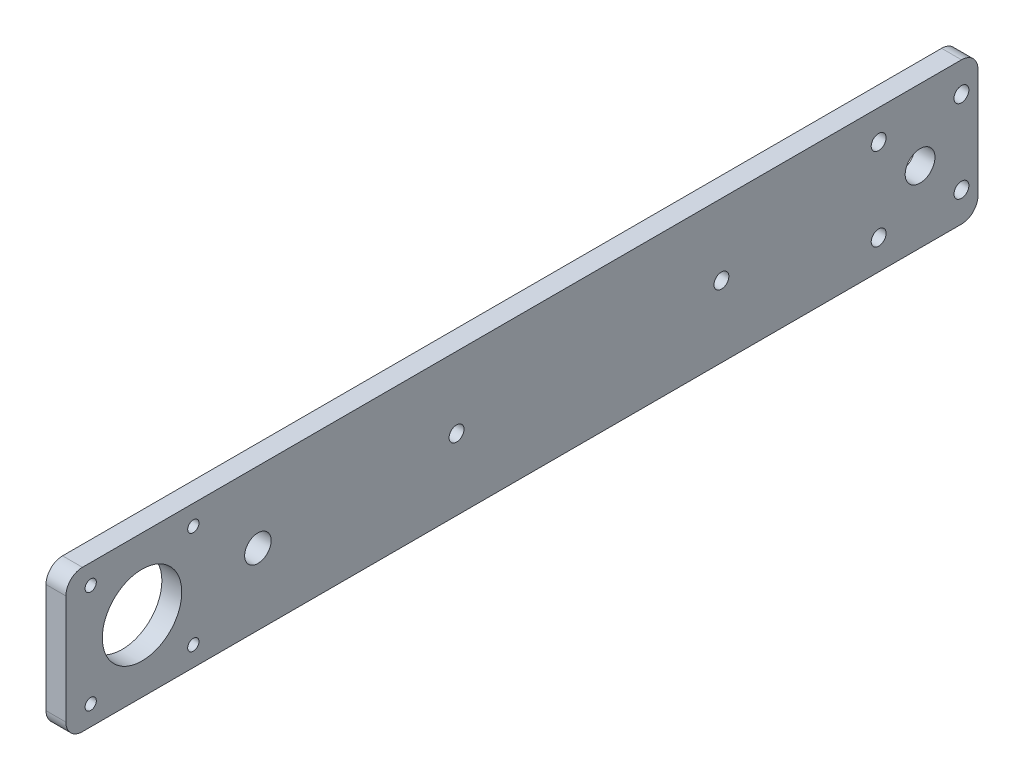
ISO-10303-21;
HEADER;
FILE_DESCRIPTION(('STEP AP214'),'2;1');
FILE_NAME('part.step','',(''),(''),'','','');
FILE_SCHEMA(('AUTOMOTIVE_DESIGN { 1 0 10303 214 1 1 1 1 }'));
ENDSEC;
DATA;
#1=APPLICATION_CONTEXT('core data for automotive mechanical design processes');
#2=APPLICATION_PROTOCOL_DEFINITION('international standard','automotive_design',2000,#1);
#3=PRODUCT_CONTEXT('',#1,'mechanical');
#4=PRODUCT('Part','Part','',(#3));
#5=PRODUCT_RELATED_PRODUCT_CATEGORY('part','',(#4));
#6=PRODUCT_DEFINITION_FORMATION('','',#4);
#7=PRODUCT_DEFINITION_CONTEXT('part definition',#1,'design');
#8=PRODUCT_DEFINITION('design','',#6,#7);
#9=PRODUCT_DEFINITION_SHAPE('','',#8);
#10=(LENGTH_UNIT() NAMED_UNIT(*) SI_UNIT(.MILLI.,.METRE.));
#11=(NAMED_UNIT(*) PLANE_ANGLE_UNIT() SI_UNIT($,.RADIAN.));
#12=(NAMED_UNIT(*) SI_UNIT($,.STERADIAN.) SOLID_ANGLE_UNIT());
#13=UNCERTAINTY_MEASURE_WITH_UNIT(LENGTH_MEASURE(1.E-05),#10,'distance_accuracy_value','');
#14=(GEOMETRIC_REPRESENTATION_CONTEXT(3) GLOBAL_UNCERTAINTY_ASSIGNED_CONTEXT((#13)) GLOBAL_UNIT_ASSIGNED_CONTEXT((#10,
#11,#12)) REPRESENTATION_CONTEXT('',''));
#15=CARTESIAN_POINT('',(0.,0.,0.));
#16=DIRECTION('',(0.,0.,1.));
#17=DIRECTION('',(1.,0.,0.));
#18=AXIS2_PLACEMENT_3D('',#15,#16,#17);
#19=CARTESIAN_POINT('',(3.,0.,0.));
#20=DIRECTION('',(-1.,0.,0.));
#21=DIRECTION('',(0.,0.,1.));
#22=AXIS2_PLACEMENT_3D('',#19,#20,#21);
#23=PLANE('',#22);
#24=CARTESIAN_POINT('',(3.,0.,-40.));
#25=DIRECTION('',(-1.,0.,0.));
#26=DIRECTION('',(0.,0.,1.));
#27=AXIS2_PLACEMENT_3D('',#24,#25,#26);
#28=CIRCLE('',#27,2.24999999999999);
#29=CARTESIAN_POINT('',(3.,0.,-37.75));
#30=VERTEX_POINT('',#29);
#31=EDGE_CURVE('E245',#30,#30,#28,.T.);
#32=ORIENTED_EDGE('',*,*,#31,.T.);
#33=EDGE_LOOP('',(#32));
#34=FACE_BOUND('',#33,.T.);
#35=CARTESIAN_POINT('',(3.,0.,40.));
#36=DIRECTION('',(-1.,0.,0.));
#37=DIRECTION('',(0.,0.,1.));
#38=AXIS2_PLACEMENT_3D('',#35,#36,#37);
#39=CIRCLE('',#38,2.24999999999999);
#40=CARTESIAN_POINT('',(3.,0.,42.25));
#41=VERTEX_POINT('',#40);
#42=EDGE_CURVE('E239',#41,#41,#39,.T.);
#43=ORIENTED_EDGE('',*,*,#42,.T.);
#44=EDGE_LOOP('',(#43));
#45=FACE_BOUND('',#44,.T.);
#46=CARTESIAN_POINT('',(3.,15.5000000000001,150.499999999996));
#47=DIRECTION('',(-1.,0.,0.));
#48=DIRECTION('',(0.,0.,1.));
#49=AXIS2_PLACEMENT_3D('',#46,#47,#48);
#50=CIRCLE('',#49,1.7);
#51=CARTESIAN_POINT('',(3.,15.5000000000001,152.199999999996));
#52=VERTEX_POINT('',#51);
#53=EDGE_CURVE('E233',#52,#52,#50,.T.);
#54=ORIENTED_EDGE('',*,*,#53,.T.);
#55=EDGE_LOOP('',(#54));
#56=FACE_BOUND('',#55,.T.);
#57=CARTESIAN_POINT('',(3.,15.5000000000001,119.499999999996));
#58=DIRECTION('',(-1.,0.,0.));
#59=DIRECTION('',(0.,0.,1.));
#60=AXIS2_PLACEMENT_3D('',#57,#58,#59);
#61=CIRCLE('',#60,1.7);
#62=CARTESIAN_POINT('',(3.,15.5000000000001,121.199999999996));
#63=VERTEX_POINT('',#62);
#64=EDGE_CURVE('E227',#63,#63,#61,.T.);
#65=ORIENTED_EDGE('',*,*,#64,.T.);
#66=EDGE_LOOP('',(#65));
#67=FACE_BOUND('',#66,.T.);
#68=CARTESIAN_POINT('',(3.,-15.4999999999999,119.499999999996));
#69=DIRECTION('',(-1.,0.,0.));
#70=DIRECTION('',(0.,0.,1.));
#71=AXIS2_PLACEMENT_3D('',#68,#69,#70);
#72=CIRCLE('',#71,1.7);
#73=CARTESIAN_POINT('',(3.,-15.4999999999999,121.199999999996));
#74=VERTEX_POINT('',#73);
#75=EDGE_CURVE('E221',#74,#74,#72,.T.);
#76=ORIENTED_EDGE('',*,*,#75,.T.);
#77=EDGE_LOOP('',(#76));
#78=FACE_BOUND('',#77,.T.);
#79=CARTESIAN_POINT('',(3.,-15.4999999999999,150.499999999996));
#80=DIRECTION('',(-1.,0.,0.));
#81=DIRECTION('',(0.,0.,1.));
#82=AXIS2_PLACEMENT_3D('',#79,#80,#81);
#83=CIRCLE('',#82,1.7);
#84=CARTESIAN_POINT('',(3.,-15.4999999999999,152.199999999996));
#85=VERTEX_POINT('',#84);
#86=EDGE_CURVE('E215',#85,#85,#83,.T.);
#87=ORIENTED_EDGE('',*,*,#86,.T.);
#88=EDGE_LOOP('',(#87));
#89=FACE_BOUND('',#88,.T.);
#90=CARTESIAN_POINT('',(3.,12.4999999999841,-112.500000000009));
#91=DIRECTION('',(1.,0.,0.));
#92=DIRECTION('',(0.,0.,-1.));
#93=AXIS2_PLACEMENT_3D('',#90,#91,#92);
#94=CIRCLE('',#93,2.25);
#95=CARTESIAN_POINT('',(3.,12.4999999999841,-114.750000000009));
#96=VERTEX_POINT('',#95);
#97=EDGE_CURVE('E212',#96,#96,#94,.T.);
#98=ORIENTED_EDGE('',*,*,#97,.F.);
#99=EDGE_LOOP('',(#98));
#100=FACE_BOUND('',#99,.T.);
#101=CARTESIAN_POINT('',(3.,-12.5000000000159,-112.500000000009));
#102=DIRECTION('',(1.,0.,0.));
#103=DIRECTION('',(0.,0.,-1.));
#104=AXIS2_PLACEMENT_3D('',#101,#102,#103);
#105=CIRCLE('',#104,2.25);
#106=CARTESIAN_POINT('',(3.,-12.5000000000159,-114.750000000009));
#107=VERTEX_POINT('',#106);
#108=EDGE_CURVE('E206',#107,#107,#105,.T.);
#109=ORIENTED_EDGE('',*,*,#108,.F.);
#110=EDGE_LOOP('',(#109));
#111=FACE_BOUND('',#110,.T.);
#112=CARTESIAN_POINT('',(3.,-12.5000000000156,-87.5000000000087));
#113=DIRECTION('',(1.,0.,0.));
#114=DIRECTION('',(0.,0.,-1.));
#115=AXIS2_PLACEMENT_3D('',#112,#113,#114);
#116=CIRCLE('',#115,2.25);
#117=CARTESIAN_POINT('',(3.,-12.5000000000156,-89.7500000000087));
#118=VERTEX_POINT('',#117);
#119=EDGE_CURVE('E200',#118,#118,#116,.T.);
#120=ORIENTED_EDGE('',*,*,#119,.F.);
#121=EDGE_LOOP('',(#120));
#122=FACE_BOUND('',#121,.T.);
#123=DIRECTION('',(0.,0.,-1.));
#124=VECTOR('',#123,1.);
#125=CARTESIAN_POINT('',(3.,-21.5,-117.5));
#126=LINE('',#125,#124);
#127=CARTESIAN_POINT('',(3.,-21.5,153.));
#128=VERTEX_POINT('',#127);
#129=CARTESIAN_POINT('',(3.,-21.5,-112.5));
#130=VERTEX_POINT('',#129);
#131=EDGE_CURVE('E173',#128,#130,#126,.T.);
#132=ORIENTED_EDGE('',*,*,#131,.T.);
#133=CARTESIAN_POINT('',(3.,-16.5,-112.5));
#134=DIRECTION('',(-1.,0.,0.));
#135=DIRECTION('',(0.,0.,1.));
#136=AXIS2_PLACEMENT_3D('',#133,#134,#135);
#137=CIRCLE('',#136,5.);
#138=CARTESIAN_POINT('',(3.,-16.5,-117.5));
#139=VERTEX_POINT('',#138);
#140=EDGE_CURVE('E150',#130,#139,#137,.F.);
#141=ORIENTED_EDGE('',*,*,#140,.T.);
#142=DIRECTION('',(0.,1.,0.));
#143=VECTOR('',#142,1.);
#144=CARTESIAN_POINT('',(3.,21.5,-117.5));
#145=LINE('',#144,#143);
#146=CARTESIAN_POINT('',(3.,16.5,-117.5));
#147=VERTEX_POINT('',#146);
#148=EDGE_CURVE('E120',#139,#147,#145,.T.);
#149=ORIENTED_EDGE('',*,*,#148,.T.);
#150=CARTESIAN_POINT('',(3.,16.5,-112.5));
#151=DIRECTION('',(-1.,0.,0.));
#152=DIRECTION('',(0.,0.,1.));
#153=AXIS2_PLACEMENT_3D('',#150,#151,#152);
#154=CIRCLE('',#153,5.);
#155=CARTESIAN_POINT('',(3.,21.5,-112.5));
#156=VERTEX_POINT('',#155);
#157=EDGE_CURVE('E57',#147,#156,#154,.F.);
#158=ORIENTED_EDGE('',*,*,#157,.T.);
#159=DIRECTION('',(0.,0.,1.));
#160=VECTOR('',#159,1.);
#161=CARTESIAN_POINT('',(3.,21.5,158.));
#162=LINE('',#161,#160);
#163=CARTESIAN_POINT('',(3.,21.5,153.));
#164=VERTEX_POINT('',#163);
#165=EDGE_CURVE('E136',#156,#164,#162,.T.);
#166=ORIENTED_EDGE('',*,*,#165,.T.);
#167=CARTESIAN_POINT('',(3.,16.5,153.));
#168=DIRECTION('',(-1.,0.,0.));
#169=DIRECTION('',(0.,0.,1.));
#170=AXIS2_PLACEMENT_3D('',#167,#168,#169);
#171=CIRCLE('',#170,5.);
#172=CARTESIAN_POINT('',(3.,16.5,158.));
#173=VERTEX_POINT('',#172);
#174=EDGE_CURVE('E145',#164,#173,#171,.F.);
#175=ORIENTED_EDGE('',*,*,#174,.T.);
#176=DIRECTION('',(0.,-1.,0.));
#177=VECTOR('',#176,1.);
#178=CARTESIAN_POINT('',(3.,21.5,158.));
#179=LINE('',#178,#177);
#180=CARTESIAN_POINT('',(3.,-16.5,158.));
#181=VERTEX_POINT('',#180);
#182=EDGE_CURVE('E130',#173,#181,#179,.T.);
#183=ORIENTED_EDGE('',*,*,#182,.T.);
#184=CARTESIAN_POINT('',(3.,-16.5,153.));
#185=DIRECTION('',(-1.,0.,0.));
#186=DIRECTION('',(0.,0.,1.));
#187=AXIS2_PLACEMENT_3D('',#184,#185,#186);
#188=CIRCLE('',#187,5.);
#189=EDGE_CURVE('E147',#181,#128,#188,.F.);
#190=ORIENTED_EDGE('',*,*,#189,.T.);
#191=EDGE_LOOP('',(#132,#141,#149,#158,#166,#175,#183,#190));
#192=FACE_BOUND('',#191,.T.);
#193=CARTESIAN_POINT('',(3.,0.,100.));
#194=DIRECTION('',(1.,0.,0.));
#195=DIRECTION('',(0.,0.,-1.));
#196=AXIS2_PLACEMENT_3D('',#193,#194,#195);
#197=CIRCLE('',#196,3.99999999999999);
#198=CARTESIAN_POINT('',(3.,0.,96.));
#199=VERTEX_POINT('',#198);
#200=EDGE_CURVE('E166',#199,#199,#197,.T.);
#201=ORIENTED_EDGE('',*,*,#200,.F.);
#202=EDGE_LOOP('',(#201));
#203=FACE_BOUND('',#202,.T.);
#204=CARTESIAN_POINT('',(3.,0.,-100.));
#205=DIRECTION('',(1.,0.,0.));
#206=DIRECTION('',(0.,0.,-1.));
#207=AXIS2_PLACEMENT_3D('',#204,#205,#206);
#208=CIRCLE('',#207,4.5);
#209=CARTESIAN_POINT('',(3.,0.,-104.5));
#210=VERTEX_POINT('',#209);
#211=EDGE_CURVE('E178',#210,#210,#208,.T.);
#212=ORIENTED_EDGE('',*,*,#211,.F.);
#213=EDGE_LOOP('',(#212));
#214=FACE_BOUND('',#213,.T.);
#215=CARTESIAN_POINT('',(3.,0.,135.));
#216=DIRECTION('',(1.,0.,0.));
#217=DIRECTION('',(0.,0.,-1.));
#218=AXIS2_PLACEMENT_3D('',#215,#216,#217);
#219=CIRCLE('',#218,12.);
#220=CARTESIAN_POINT('',(3.,0.,123.));
#221=VERTEX_POINT('',#220);
#222=EDGE_CURVE('E183',#221,#221,#219,.T.);
#223=ORIENTED_EDGE('',*,*,#222,.F.);
#224=EDGE_LOOP('',(#223));
#225=FACE_BOUND('',#224,.T.);
#226=CARTESIAN_POINT('',(3.,12.4999999999844,-87.500000000009));
#227=DIRECTION('',(1.,0.,0.));
#228=DIRECTION('',(0.,0.,-1.));
#229=AXIS2_PLACEMENT_3D('',#226,#227,#228);
#230=CIRCLE('',#229,2.25);
#231=CARTESIAN_POINT('',(3.,12.4999999999844,-89.750000000009));
#232=VERTEX_POINT('',#231);
#233=EDGE_CURVE('E194',#232,#232,#230,.T.);
#234=ORIENTED_EDGE('',*,*,#233,.F.);
#235=EDGE_LOOP('',(#234));
#236=FACE_BOUND('',#235,.T.);
#237=ADVANCED_FACE('F35',(#34,#45,#56,#67,#78,#89,#100,#111,#122,#192,#203,#214,#225,#236),#23,.F.);
#238=CARTESIAN_POINT('',(-3.,0.,0.));
#239=DIRECTION('',(-1.,0.,0.));
#240=DIRECTION('',(0.,0.,1.));
#241=AXIS2_PLACEMENT_3D('',#238,#239,#240);
#242=PLANE('',#241);
#243=CARTESIAN_POINT('',(-3.,0.,-40.));
#244=DIRECTION('',(-1.,0.,0.));
#245=DIRECTION('',(0.,0.,1.));
#246=AXIS2_PLACEMENT_3D('',#243,#244,#245);
#247=CIRCLE('',#246,2.24999999999999);
#248=CARTESIAN_POINT('',(-3.,0.,-37.75));
#249=VERTEX_POINT('',#248);
#250=EDGE_CURVE('E248',#249,#249,#247,.T.);
#251=ORIENTED_EDGE('',*,*,#250,.F.);
#252=EDGE_LOOP('',(#251));
#253=FACE_BOUND('',#252,.T.);
#254=CARTESIAN_POINT('',(-3.,0.,40.));
#255=DIRECTION('',(-1.,0.,0.));
#256=DIRECTION('',(0.,0.,1.));
#257=AXIS2_PLACEMENT_3D('',#254,#255,#256);
#258=CIRCLE('',#257,2.24999999999999);
#259=CARTESIAN_POINT('',(-3.,0.,42.25));
#260=VERTEX_POINT('',#259);
#261=EDGE_CURVE('E242',#260,#260,#258,.T.);
#262=ORIENTED_EDGE('',*,*,#261,.F.);
#263=EDGE_LOOP('',(#262));
#264=FACE_BOUND('',#263,.T.);
#265=CARTESIAN_POINT('',(-3.,15.5000000000001,150.499999999996));
#266=DIRECTION('',(-1.,0.,0.));
#267=DIRECTION('',(0.,0.,1.));
#268=AXIS2_PLACEMENT_3D('',#265,#266,#267);
#269=CIRCLE('',#268,1.7);
#270=CARTESIAN_POINT('',(-3.,15.5000000000001,152.199999999996));
#271=VERTEX_POINT('',#270);
#272=EDGE_CURVE('E236',#271,#271,#269,.T.);
#273=ORIENTED_EDGE('',*,*,#272,.F.);
#274=EDGE_LOOP('',(#273));
#275=FACE_BOUND('',#274,.T.);
#276=CARTESIAN_POINT('',(-3.,15.5000000000001,119.499999999996));
#277=DIRECTION('',(-1.,0.,0.));
#278=DIRECTION('',(0.,0.,1.));
#279=AXIS2_PLACEMENT_3D('',#276,#277,#278);
#280=CIRCLE('',#279,1.7);
#281=CARTESIAN_POINT('',(-3.,15.5000000000001,121.199999999996));
#282=VERTEX_POINT('',#281);
#283=EDGE_CURVE('E230',#282,#282,#280,.T.);
#284=ORIENTED_EDGE('',*,*,#283,.F.);
#285=EDGE_LOOP('',(#284));
#286=FACE_BOUND('',#285,.T.);
#287=CARTESIAN_POINT('',(-3.,-15.4999999999999,119.499999999996));
#288=DIRECTION('',(-1.,0.,0.));
#289=DIRECTION('',(0.,0.,1.));
#290=AXIS2_PLACEMENT_3D('',#287,#288,#289);
#291=CIRCLE('',#290,1.7);
#292=CARTESIAN_POINT('',(-3.,-15.4999999999999,121.199999999996));
#293=VERTEX_POINT('',#292);
#294=EDGE_CURVE('E224',#293,#293,#291,.T.);
#295=ORIENTED_EDGE('',*,*,#294,.F.);
#296=EDGE_LOOP('',(#295));
#297=FACE_BOUND('',#296,.T.);
#298=CARTESIAN_POINT('',(-3.,-15.4999999999999,150.499999999996));
#299=DIRECTION('',(-1.,0.,0.));
#300=DIRECTION('',(0.,0.,1.));
#301=AXIS2_PLACEMENT_3D('',#298,#299,#300);
#302=CIRCLE('',#301,1.7);
#303=CARTESIAN_POINT('',(-3.,-15.4999999999999,152.199999999996));
#304=VERTEX_POINT('',#303);
#305=EDGE_CURVE('E218',#304,#304,#302,.T.);
#306=ORIENTED_EDGE('',*,*,#305,.F.);
#307=EDGE_LOOP('',(#306));
#308=FACE_BOUND('',#307,.T.);
#309=CARTESIAN_POINT('',(-3.,12.4999999999841,-112.500000000009));
#310=DIRECTION('',(-1.,0.,0.));
#311=DIRECTION('',(0.,0.,1.));
#312=AXIS2_PLACEMENT_3D('',#309,#310,#311);
#313=CIRCLE('',#312,2.25);
#314=CARTESIAN_POINT('',(-3.,12.4999999999841,-110.250000000009));
#315=VERTEX_POINT('',#314);
#316=EDGE_CURVE('E209',#315,#315,#313,.T.);
#317=ORIENTED_EDGE('',*,*,#316,.F.);
#318=EDGE_LOOP('',(#317));
#319=FACE_BOUND('',#318,.T.);
#320=CARTESIAN_POINT('',(-3.,-12.5000000000159,-112.500000000009));
#321=DIRECTION('',(-1.,0.,0.));
#322=DIRECTION('',(0.,0.,1.));
#323=AXIS2_PLACEMENT_3D('',#320,#321,#322);
#324=CIRCLE('',#323,2.25);
#325=CARTESIAN_POINT('',(-3.,-12.5000000000159,-110.250000000009));
#326=VERTEX_POINT('',#325);
#327=EDGE_CURVE('E203',#326,#326,#324,.T.);
#328=ORIENTED_EDGE('',*,*,#327,.F.);
#329=EDGE_LOOP('',(#328));
#330=FACE_BOUND('',#329,.T.);
#331=CARTESIAN_POINT('',(-3.,-12.5000000000156,-87.5000000000087));
#332=DIRECTION('',(-1.,0.,0.));
#333=DIRECTION('',(0.,0.,1.));
#334=AXIS2_PLACEMENT_3D('',#331,#332,#333);
#335=CIRCLE('',#334,2.25);
#336=CARTESIAN_POINT('',(-3.,-12.5000000000156,-85.2500000000087));
#337=VERTEX_POINT('',#336);
#338=EDGE_CURVE('E197',#337,#337,#335,.T.);
#339=ORIENTED_EDGE('',*,*,#338,.F.);
#340=EDGE_LOOP('',(#339));
#341=FACE_BOUND('',#340,.T.);
#342=CARTESIAN_POINT('',(-3.,12.4999999999844,-87.500000000009));
#343=DIRECTION('',(-1.,0.,0.));
#344=DIRECTION('',(0.,0.,1.));
#345=AXIS2_PLACEMENT_3D('',#342,#343,#344);
#346=CIRCLE('',#345,2.25);
#347=CARTESIAN_POINT('',(-3.,12.4999999999844,-85.250000000009));
#348=VERTEX_POINT('',#347);
#349=EDGE_CURVE('E189',#348,#348,#346,.T.);
#350=ORIENTED_EDGE('',*,*,#349,.F.);
#351=EDGE_LOOP('',(#350));
#352=FACE_BOUND('',#351,.T.);
#353=CARTESIAN_POINT('',(-3.,0.,-100.));
#354=DIRECTION('',(1.,0.,0.));
#355=DIRECTION('',(0.,0.,-1.));
#356=AXIS2_PLACEMENT_3D('',#353,#354,#355);
#357=CIRCLE('',#356,4.5);
#358=CARTESIAN_POINT('',(-3.,0.,-104.5));
#359=VERTEX_POINT('',#358);
#360=EDGE_CURVE('E180',#359,#359,#357,.T.);
#361=ORIENTED_EDGE('',*,*,#360,.T.);
#362=EDGE_LOOP('',(#361));
#363=FACE_BOUND('',#362,.T.);
#364=DIRECTION('',(0.,1.,0.));
#365=VECTOR('',#364,1.);
#366=CARTESIAN_POINT('',(-3.,21.5,-117.5));
#367=LINE('',#366,#365);
#368=CARTESIAN_POINT('',(-3.,-16.5,-117.5));
#369=VERTEX_POINT('',#368);
#370=CARTESIAN_POINT('',(-3.,16.5,-117.5));
#371=VERTEX_POINT('',#370);
#372=EDGE_CURVE('E118',#369,#371,#367,.T.);
#373=ORIENTED_EDGE('',*,*,#372,.F.);
#374=CARTESIAN_POINT('',(-3.,-16.5,-112.5));
#375=DIRECTION('',(-1.,0.,0.));
#376=DIRECTION('',(0.,0.,1.));
#377=AXIS2_PLACEMENT_3D('',#374,#375,#376);
#378=CIRCLE('',#377,5.);
#379=CARTESIAN_POINT('',(-3.,-21.5,-112.5));
#380=VERTEX_POINT('',#379);
#381=EDGE_CURVE('E101',#369,#380,#378,.T.);
#382=ORIENTED_EDGE('',*,*,#381,.T.);
#383=DIRECTION('',(0.,0.,-1.));
#384=VECTOR('',#383,1.);
#385=CARTESIAN_POINT('',(-3.,-21.5,-117.5));
#386=LINE('',#385,#384);
#387=CARTESIAN_POINT('',(-3.,-21.5,153.));
#388=VERTEX_POINT('',#387);
#389=EDGE_CURVE('E128',#388,#380,#386,.T.);
#390=ORIENTED_EDGE('',*,*,#389,.F.);
#391=CARTESIAN_POINT('',(-3.,-16.5,153.));
#392=DIRECTION('',(-1.,0.,0.));
#393=DIRECTION('',(0.,0.,1.));
#394=AXIS2_PLACEMENT_3D('',#391,#392,#393);
#395=CIRCLE('',#394,5.);
#396=CARTESIAN_POINT('',(-3.,-16.5,158.));
#397=VERTEX_POINT('',#396);
#398=EDGE_CURVE('E139',#388,#397,#395,.T.);
#399=ORIENTED_EDGE('',*,*,#398,.T.);
#400=DIRECTION('',(0.,-1.,0.));
#401=VECTOR('',#400,1.);
#402=CARTESIAN_POINT('',(-3.,21.5,158.));
#403=LINE('',#402,#401);
#404=CARTESIAN_POINT('',(-3.,16.5,158.));
#405=VERTEX_POINT('',#404);
#406=EDGE_CURVE('E132',#405,#397,#403,.T.);
#407=ORIENTED_EDGE('',*,*,#406,.F.);
#408=CARTESIAN_POINT('',(-3.,16.5,153.));
#409=DIRECTION('',(-1.,0.,0.));
#410=DIRECTION('',(0.,0.,1.));
#411=AXIS2_PLACEMENT_3D('',#408,#409,#410);
#412=CIRCLE('',#411,5.);
#413=CARTESIAN_POINT('',(-3.,21.5,153.));
#414=VERTEX_POINT('',#413);
#415=EDGE_CURVE('E121',#405,#414,#412,.T.);
#416=ORIENTED_EDGE('',*,*,#415,.T.);
#417=DIRECTION('',(0.,0.,1.));
#418=VECTOR('',#417,1.);
#419=CARTESIAN_POINT('',(-3.,21.5,158.));
#420=LINE('',#419,#418);
#421=CARTESIAN_POINT('',(-3.,21.5,-112.5));
#422=VERTEX_POINT('',#421);
#423=EDGE_CURVE('E127',#422,#414,#420,.T.);
#424=ORIENTED_EDGE('',*,*,#423,.F.);
#425=CARTESIAN_POINT('',(-3.,16.5,-112.5));
#426=DIRECTION('',(-1.,0.,0.));
#427=DIRECTION('',(0.,0.,1.));
#428=AXIS2_PLACEMENT_3D('',#425,#426,#427);
#429=CIRCLE('',#428,5.);
#430=EDGE_CURVE('E112',#422,#371,#429,.T.);
#431=ORIENTED_EDGE('',*,*,#430,.T.);
#432=EDGE_LOOP('',(#373,#382,#390,#399,#407,#416,#424,#431));
#433=FACE_BOUND('',#432,.T.);
#434=CARTESIAN_POINT('',(-3.,0.,100.));
#435=DIRECTION('',(1.,0.,0.));
#436=DIRECTION('',(0.,0.,-1.));
#437=AXIS2_PLACEMENT_3D('',#434,#435,#436);
#438=CIRCLE('',#437,3.99999999999999);
#439=CARTESIAN_POINT('',(-3.,0.,96.));
#440=VERTEX_POINT('',#439);
#441=EDGE_CURVE('E168',#440,#440,#438,.T.);
#442=ORIENTED_EDGE('',*,*,#441,.T.);
#443=EDGE_LOOP('',(#442));
#444=FACE_BOUND('',#443,.T.);
#445=CARTESIAN_POINT('',(-3.,0.,135.));
#446=DIRECTION('',(1.,0.,0.));
#447=DIRECTION('',(0.,0.,-1.));
#448=AXIS2_PLACEMENT_3D('',#445,#446,#447);
#449=CIRCLE('',#448,12.);
#450=CARTESIAN_POINT('',(-3.,0.,123.));
#451=VERTEX_POINT('',#450);
#452=EDGE_CURVE('E186',#451,#451,#449,.T.);
#453=ORIENTED_EDGE('',*,*,#452,.T.);
#454=EDGE_LOOP('',(#453));
#455=FACE_BOUND('',#454,.T.);
#456=ADVANCED_FACE('F124',(#253,#264,#275,#286,#297,#308,#319,#330,#341,#352,#363,#433,#444,
#455),#242,.T.);
#457=CARTESIAN_POINT('',(3.,21.5,158.));
#458=DIRECTION('',(0.,0.,-1.));
#459=DIRECTION('',(-1.,0.,0.));
#460=AXIS2_PLACEMENT_3D('',#457,#458,#459);
#461=PLANE('',#460);
#462=ORIENTED_EDGE('',*,*,#406,.T.);
#463=DIRECTION('',(-1.,0.,0.));
#464=VECTOR('',#463,1.);
#465=CARTESIAN_POINT('',(3.,-16.5,158.));
#466=LINE('',#465,#464);
#467=EDGE_CURVE('E11',#397,#181,#466,.F.);
#468=ORIENTED_EDGE('',*,*,#467,.T.);
#469=ORIENTED_EDGE('',*,*,#182,.F.);
#470=DIRECTION('',(-1.,0.,0.));
#471=VECTOR('',#470,1.);
#472=CARTESIAN_POINT('',(3.,16.5,158.));
#473=LINE('',#472,#471);
#474=EDGE_CURVE('E43',#173,#405,#473,.T.);
#475=ORIENTED_EDGE('',*,*,#474,.T.);
#476=EDGE_LOOP('',(#462,#468,#469,#475));
#477=FACE_BOUND('',#476,.T.);
#478=ADVANCED_FACE('F161',(#477),#461,.F.);
#479=CARTESIAN_POINT('',(3.,-21.5,-117.5));
#480=DIRECTION('',(0.,1.,0.));
#481=DIRECTION('',(0.,0.,1.));
#482=AXIS2_PLACEMENT_3D('',#479,#480,#481);
#483=PLANE('',#482);
#484=ORIENTED_EDGE('',*,*,#389,.T.);
#485=DIRECTION('',(-1.,0.,0.));
#486=VECTOR('',#485,1.);
#487=CARTESIAN_POINT('',(3.,-21.5,-112.5));
#488=LINE('',#487,#486);
#489=EDGE_CURVE('E106',#380,#130,#488,.F.);
#490=ORIENTED_EDGE('',*,*,#489,.T.);
#491=ORIENTED_EDGE('',*,*,#131,.F.);
#492=DIRECTION('',(-1.,0.,0.));
#493=VECTOR('',#492,1.);
#494=CARTESIAN_POINT('',(3.,-21.5,153.));
#495=LINE('',#494,#493);
#496=EDGE_CURVE('E111',#128,#388,#495,.T.);
#497=ORIENTED_EDGE('',*,*,#496,.T.);
#498=EDGE_LOOP('',(#484,#490,#491,#497));
#499=FACE_BOUND('',#498,.T.);
#500=ADVANCED_FACE('F304',(#499),#483,.F.);
#501=CARTESIAN_POINT('',(3.,21.5,-117.5));
#502=DIRECTION('',(0.,0.,1.));
#503=DIRECTION('',(1.,0.,0.));
#504=AXIS2_PLACEMENT_3D('',#501,#502,#503);
#505=PLANE('',#504);
#506=ORIENTED_EDGE('',*,*,#148,.F.);
#507=DIRECTION('',(-1.,0.,0.));
#508=VECTOR('',#507,1.);
#509=CARTESIAN_POINT('',(3.,-16.5,-117.5));
#510=LINE('',#509,#508);
#511=EDGE_CURVE('E105',#139,#369,#510,.T.);
#512=ORIENTED_EDGE('',*,*,#511,.T.);
#513=ORIENTED_EDGE('',*,*,#372,.T.);
#514=DIRECTION('',(-1.,0.,0.));
#515=VECTOR('',#514,1.);
#516=CARTESIAN_POINT('',(3.,16.5,-117.5));
#517=LINE('',#516,#515);
#518=EDGE_CURVE('E122',#371,#147,#517,.F.);
#519=ORIENTED_EDGE('',*,*,#518,.T.);
#520=EDGE_LOOP('',(#506,#512,#513,#519));
#521=FACE_BOUND('',#520,.T.);
#522=ADVANCED_FACE('F117',(#521),#505,.F.);
#523=CARTESIAN_POINT('',(3.,21.5,158.));
#524=DIRECTION('',(0.,-1.,0.));
#525=DIRECTION('',(0.,0.,-1.));
#526=AXIS2_PLACEMENT_3D('',#523,#524,#525);
#527=PLANE('',#526);
#528=ORIENTED_EDGE('',*,*,#165,.F.);
#529=DIRECTION('',(-1.,0.,0.));
#530=VECTOR('',#529,1.);
#531=CARTESIAN_POINT('',(3.,21.5,-112.5));
#532=LINE('',#531,#530);
#533=EDGE_CURVE('E153',#156,#422,#532,.T.);
#534=ORIENTED_EDGE('',*,*,#533,.T.);
#535=ORIENTED_EDGE('',*,*,#423,.T.);
#536=DIRECTION('',(-1.,0.,0.));
#537=VECTOR('',#536,1.);
#538=CARTESIAN_POINT('',(3.,21.5,153.));
#539=LINE('',#538,#537);
#540=EDGE_CURVE('E50',#414,#164,#539,.F.);
#541=ORIENTED_EDGE('',*,*,#540,.T.);
#542=EDGE_LOOP('',(#528,#534,#535,#541));
#543=FACE_BOUND('',#542,.T.);
#544=ADVANCED_FACE('F289',(#543),#527,.F.);
#545=CARTESIAN_POINT('',(3.,0.,100.));
#546=DIRECTION('',(-1.,0.,0.));
#547=DIRECTION('',(0.,0.,1.));
#548=AXIS2_PLACEMENT_3D('',#545,#546,#547);
#549=CYLINDRICAL_SURFACE('',#548,3.99999999999999);
#550=ORIENTED_EDGE('',*,*,#200,.T.);
#551=EDGE_LOOP('',(#550));
#552=FACE_BOUND('',#551,.T.);
#553=ORIENTED_EDGE('',*,*,#441,.F.);
#554=EDGE_LOOP('',(#553));
#555=FACE_BOUND('',#554,.T.);
#556=ADVANCED_FACE('F280',(#552,#555),#549,.F.);
#557=CARTESIAN_POINT('',(3.,0.,-100.));
#558=DIRECTION('',(-1.,0.,0.));
#559=DIRECTION('',(0.,0.,1.));
#560=AXIS2_PLACEMENT_3D('',#557,#558,#559);
#561=CYLINDRICAL_SURFACE('',#560,4.5);
#562=ORIENTED_EDGE('',*,*,#211,.T.);
#563=EDGE_LOOP('',(#562));
#564=FACE_BOUND('',#563,.T.);
#565=ORIENTED_EDGE('',*,*,#360,.F.);
#566=EDGE_LOOP('',(#565));
#567=FACE_BOUND('',#566,.T.);
#568=ADVANCED_FACE('F277',(#564,#567),#561,.F.);
#569=CARTESIAN_POINT('',(3.,0.,135.));
#570=DIRECTION('',(-1.,0.,0.));
#571=DIRECTION('',(0.,0.,1.));
#572=AXIS2_PLACEMENT_3D('',#569,#570,#571);
#573=CYLINDRICAL_SURFACE('',#572,12.);
#574=ORIENTED_EDGE('',*,*,#222,.T.);
#575=EDGE_LOOP('',(#574));
#576=FACE_BOUND('',#575,.T.);
#577=ORIENTED_EDGE('',*,*,#452,.F.);
#578=EDGE_LOOP('',(#577));
#579=FACE_BOUND('',#578,.T.);
#580=ADVANCED_FACE('F279',(#576,#579),#573,.F.);
#581=CARTESIAN_POINT('',(3.,-16.5,-112.5));
#582=DIRECTION('',(-1.,0.,0.));
#583=DIRECTION('',(0.,0.,1.));
#584=AXIS2_PLACEMENT_3D('',#581,#582,#583);
#585=CYLINDRICAL_SURFACE('',#584,5.);
#586=ORIENTED_EDGE('',*,*,#140,.F.);
#587=ORIENTED_EDGE('',*,*,#489,.F.);
#588=ORIENTED_EDGE('',*,*,#381,.F.);
#589=ORIENTED_EDGE('',*,*,#511,.F.);
#590=EDGE_LOOP('',(#586,#587,#588,#589));
#591=FACE_BOUND('',#590,.T.);
#592=ADVANCED_FACE('F104',(#591),#585,.T.);
#593=CARTESIAN_POINT('',(3.,16.5,-112.5));
#594=DIRECTION('',(-1.,0.,0.));
#595=DIRECTION('',(0.,0.,1.));
#596=AXIS2_PLACEMENT_3D('',#593,#594,#595);
#597=CYLINDRICAL_SURFACE('',#596,5.);
#598=ORIENTED_EDGE('',*,*,#157,.F.);
#599=ORIENTED_EDGE('',*,*,#518,.F.);
#600=ORIENTED_EDGE('',*,*,#430,.F.);
#601=ORIENTED_EDGE('',*,*,#533,.F.);
#602=EDGE_LOOP('',(#598,#599,#600,#601));
#603=FACE_BOUND('',#602,.T.);
#604=ADVANCED_FACE('F312',(#603),#597,.T.);
#605=CARTESIAN_POINT('',(3.,-16.5,153.));
#606=DIRECTION('',(-1.,0.,0.));
#607=DIRECTION('',(0.,0.,1.));
#608=AXIS2_PLACEMENT_3D('',#605,#606,#607);
#609=CYLINDRICAL_SURFACE('',#608,5.);
#610=ORIENTED_EDGE('',*,*,#189,.F.);
#611=ORIENTED_EDGE('',*,*,#467,.F.);
#612=ORIENTED_EDGE('',*,*,#398,.F.);
#613=ORIENTED_EDGE('',*,*,#496,.F.);
#614=EDGE_LOOP('',(#610,#611,#612,#613));
#615=FACE_BOUND('',#614,.T.);
#616=ADVANCED_FACE('F314',(#615),#609,.T.);
#617=CARTESIAN_POINT('',(3.,16.5,153.));
#618=DIRECTION('',(-1.,0.,0.));
#619=DIRECTION('',(0.,0.,1.));
#620=AXIS2_PLACEMENT_3D('',#617,#618,#619);
#621=CYLINDRICAL_SURFACE('',#620,5.);
#622=ORIENTED_EDGE('',*,*,#174,.F.);
#623=ORIENTED_EDGE('',*,*,#540,.F.);
#624=ORIENTED_EDGE('',*,*,#415,.F.);
#625=ORIENTED_EDGE('',*,*,#474,.F.);
#626=EDGE_LOOP('',(#622,#623,#624,#625));
#627=FACE_BOUND('',#626,.T.);
#628=ADVANCED_FACE('F37',(#627),#621,.T.);
#629=CARTESIAN_POINT('',(3.,12.4999999999844,-87.500000000009));
#630=DIRECTION('',(1.,0.,0.));
#631=DIRECTION('',(0.,0.,-1.));
#632=AXIS2_PLACEMENT_3D('',#629,#630,#631);
#633=CYLINDRICAL_SURFACE('',#632,2.25);
#634=ORIENTED_EDGE('',*,*,#233,.T.);
#635=EDGE_LOOP('',(#634));
#636=FACE_BOUND('',#635,.T.);
#637=ORIENTED_EDGE('',*,*,#349,.T.);
#638=EDGE_LOOP('',(#637));
#639=FACE_BOUND('',#638,.T.);
#640=ADVANCED_FACE('F321',(#636,#639),#633,.F.);
#641=CARTESIAN_POINT('',(3.,-12.5000000000156,-87.5000000000087));
#642=DIRECTION('',(1.,0.,0.));
#643=DIRECTION('',(0.,0.,-1.));
#644=AXIS2_PLACEMENT_3D('',#641,#642,#643);
#645=CYLINDRICAL_SURFACE('',#644,2.25);
#646=ORIENTED_EDGE('',*,*,#119,.T.);
#647=EDGE_LOOP('',(#646));
#648=FACE_BOUND('',#647,.T.);
#649=ORIENTED_EDGE('',*,*,#338,.T.);
#650=EDGE_LOOP('',(#649));
#651=FACE_BOUND('',#650,.T.);
#652=ADVANCED_FACE('F337',(#648,#651),#645,.F.);
#653=CARTESIAN_POINT('',(3.,-12.5000000000159,-112.500000000009));
#654=DIRECTION('',(1.,0.,0.));
#655=DIRECTION('',(0.,0.,-1.));
#656=AXIS2_PLACEMENT_3D('',#653,#654,#655);
#657=CYLINDRICAL_SURFACE('',#656,2.25);
#658=ORIENTED_EDGE('',*,*,#108,.T.);
#659=EDGE_LOOP('',(#658));
#660=FACE_BOUND('',#659,.T.);
#661=ORIENTED_EDGE('',*,*,#327,.T.);
#662=EDGE_LOOP('',(#661));
#663=FACE_BOUND('',#662,.T.);
#664=ADVANCED_FACE('F342',(#660,#663),#657,.F.);
#665=CARTESIAN_POINT('',(3.,12.4999999999841,-112.500000000009));
#666=DIRECTION('',(1.,0.,0.));
#667=DIRECTION('',(0.,0.,-1.));
#668=AXIS2_PLACEMENT_3D('',#665,#666,#667);
#669=CYLINDRICAL_SURFACE('',#668,2.25);
#670=ORIENTED_EDGE('',*,*,#97,.T.);
#671=EDGE_LOOP('',(#670));
#672=FACE_BOUND('',#671,.T.);
#673=ORIENTED_EDGE('',*,*,#316,.T.);
#674=EDGE_LOOP('',(#673));
#675=FACE_BOUND('',#674,.T.);
#676=ADVANCED_FACE('F348',(#672,#675),#669,.F.);
#677=CARTESIAN_POINT('',(-3.,-15.4999999999999,150.499999999996));
#678=DIRECTION('',(-1.,0.,0.));
#679=DIRECTION('',(0.,0.,1.));
#680=AXIS2_PLACEMENT_3D('',#677,#678,#679);
#681=CYLINDRICAL_SURFACE('',#680,1.7);
#682=ORIENTED_EDGE('',*,*,#86,.F.);
#683=EDGE_LOOP('',(#682));
#684=FACE_BOUND('',#683,.T.);
#685=ORIENTED_EDGE('',*,*,#305,.T.);
#686=EDGE_LOOP('',(#685));
#687=FACE_BOUND('',#686,.T.);
#688=ADVANCED_FACE('F352',(#684,#687),#681,.F.);
#689=CARTESIAN_POINT('',(-3.,-15.4999999999999,119.499999999996));
#690=DIRECTION('',(-1.,0.,0.));
#691=DIRECTION('',(0.,0.,1.));
#692=AXIS2_PLACEMENT_3D('',#689,#690,#691);
#693=CYLINDRICAL_SURFACE('',#692,1.7);
#694=ORIENTED_EDGE('',*,*,#75,.F.);
#695=EDGE_LOOP('',(#694));
#696=FACE_BOUND('',#695,.T.);
#697=ORIENTED_EDGE('',*,*,#294,.T.);
#698=EDGE_LOOP('',(#697));
#699=FACE_BOUND('',#698,.T.);
#700=ADVANCED_FACE('F356',(#696,#699),#693,.F.);
#701=CARTESIAN_POINT('',(-3.,15.5000000000001,119.499999999996));
#702=DIRECTION('',(-1.,0.,0.));
#703=DIRECTION('',(0.,0.,1.));
#704=AXIS2_PLACEMENT_3D('',#701,#702,#703);
#705=CYLINDRICAL_SURFACE('',#704,1.7);
#706=ORIENTED_EDGE('',*,*,#64,.F.);
#707=EDGE_LOOP('',(#706));
#708=FACE_BOUND('',#707,.T.);
#709=ORIENTED_EDGE('',*,*,#283,.T.);
#710=EDGE_LOOP('',(#709));
#711=FACE_BOUND('',#710,.T.);
#712=ADVANCED_FACE('F360',(#708,#711),#705,.F.);
#713=CARTESIAN_POINT('',(-3.,15.5000000000001,150.499999999996));
#714=DIRECTION('',(-1.,0.,0.));
#715=DIRECTION('',(0.,0.,1.));
#716=AXIS2_PLACEMENT_3D('',#713,#714,#715);
#717=CYLINDRICAL_SURFACE('',#716,1.7);
#718=ORIENTED_EDGE('',*,*,#53,.F.);
#719=EDGE_LOOP('',(#718));
#720=FACE_BOUND('',#719,.T.);
#721=ORIENTED_EDGE('',*,*,#272,.T.);
#722=EDGE_LOOP('',(#721));
#723=FACE_BOUND('',#722,.T.);
#724=ADVANCED_FACE('F364',(#720,#723),#717,.F.);
#725=CARTESIAN_POINT('',(-3.,0.,40.));
#726=DIRECTION('',(-1.,0.,0.));
#727=DIRECTION('',(0.,0.,1.));
#728=AXIS2_PLACEMENT_3D('',#725,#726,#727);
#729=CYLINDRICAL_SURFACE('',#728,2.24999999999999);
#730=ORIENTED_EDGE('',*,*,#42,.F.);
#731=EDGE_LOOP('',(#730));
#732=FACE_BOUND('',#731,.T.);
#733=ORIENTED_EDGE('',*,*,#261,.T.);
#734=EDGE_LOOP('',(#733));
#735=FACE_BOUND('',#734,.T.);
#736=ADVANCED_FACE('F368',(#732,#735),#729,.F.);
#737=CARTESIAN_POINT('',(-3.,0.,-40.));
#738=DIRECTION('',(-1.,0.,0.));
#739=DIRECTION('',(0.,0.,1.));
#740=AXIS2_PLACEMENT_3D('',#737,#738,#739);
#741=CYLINDRICAL_SURFACE('',#740,2.24999999999999);
#742=ORIENTED_EDGE('',*,*,#31,.F.);
#743=EDGE_LOOP('',(#742));
#744=FACE_BOUND('',#743,.T.);
#745=ORIENTED_EDGE('',*,*,#250,.T.);
#746=EDGE_LOOP('',(#745));
#747=FACE_BOUND('',#746,.T.);
#748=ADVANCED_FACE('F252',(#744,#747),#741,.F.);
#749=CLOSED_SHELL('',(#237,#456,#478,#500,#522,#544,#556,#568,#580,#592,#604,#616,#628,#640,
#652,#664,#676,#688,#700,#712,#724,#736,#748));
#750=MANIFOLD_SOLID_BREP('B2',#749);
#751=ADVANCED_BREP_SHAPE_REPRESENTATION('',(#18,#750),#14);
#752=SHAPE_DEFINITION_REPRESENTATION(#9,#751);
ENDSEC;
END-ISO-10303-21;
